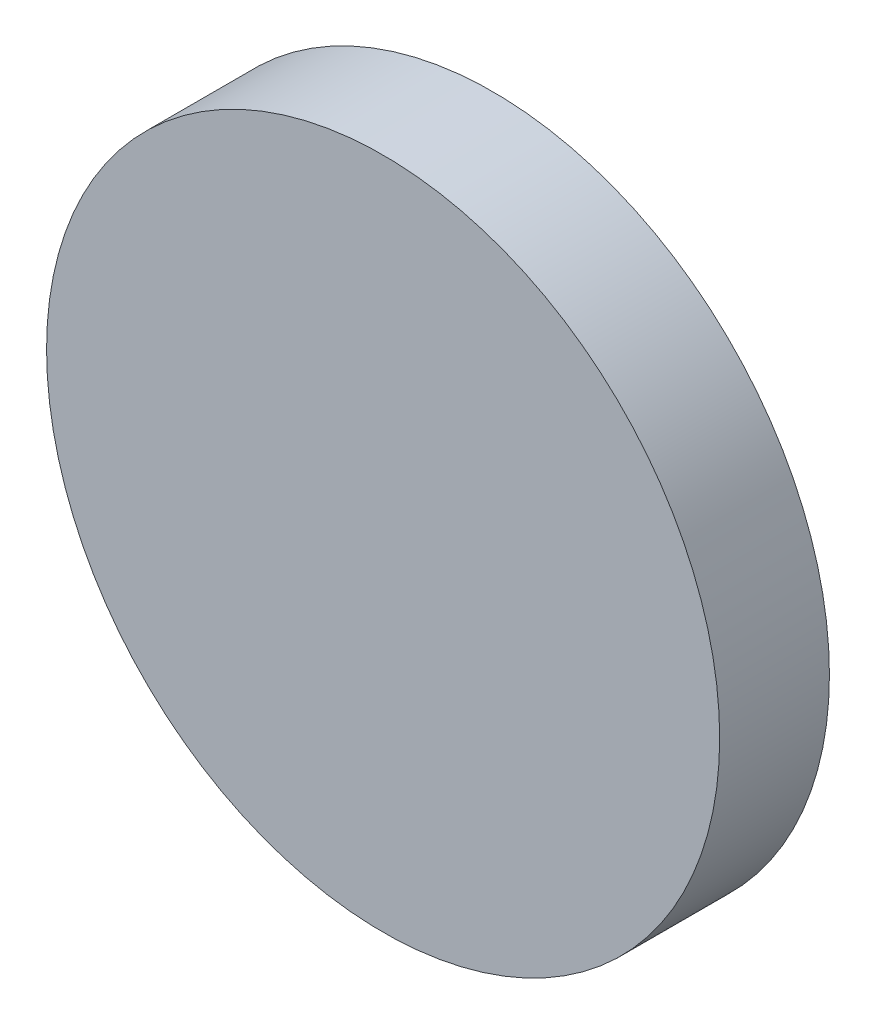
ISO-10303-21;
HEADER;
FILE_DESCRIPTION(('STEP AP214'),'2;1');
FILE_NAME('part.step','',(''),(''),'','','');
FILE_SCHEMA(('AUTOMOTIVE_DESIGN { 1 0 10303 214 1 1 1 1 }'));
ENDSEC;
DATA;
#1=APPLICATION_CONTEXT('core data for automotive mechanical design processes');
#2=APPLICATION_PROTOCOL_DEFINITION('international standard','automotive_design',2000,#1);
#3=PRODUCT_CONTEXT('',#1,'mechanical');
#4=PRODUCT('Part','Part','',(#3));
#5=PRODUCT_RELATED_PRODUCT_CATEGORY('part','',(#4));
#6=PRODUCT_DEFINITION_FORMATION('','',#4);
#7=PRODUCT_DEFINITION_CONTEXT('part definition',#1,'design');
#8=PRODUCT_DEFINITION('design','',#6,#7);
#9=PRODUCT_DEFINITION_SHAPE('','',#8);
#10=(LENGTH_UNIT() NAMED_UNIT(*) SI_UNIT(.MILLI.,.METRE.));
#11=(NAMED_UNIT(*) PLANE_ANGLE_UNIT() SI_UNIT($,.RADIAN.));
#12=(NAMED_UNIT(*) SI_UNIT($,.STERADIAN.) SOLID_ANGLE_UNIT());
#13=UNCERTAINTY_MEASURE_WITH_UNIT(LENGTH_MEASURE(1.E-05),#10,'distance_accuracy_value','');
#14=(GEOMETRIC_REPRESENTATION_CONTEXT(3) GLOBAL_UNCERTAINTY_ASSIGNED_CONTEXT((#13)) GLOBAL_UNIT_ASSIGNED_CONTEXT((#10,
#11,#12)) REPRESENTATION_CONTEXT('',''));
#15=CARTESIAN_POINT('',(0.,0.,0.));
#16=DIRECTION('',(0.,0.,1.));
#17=DIRECTION('',(1.,0.,0.));
#18=AXIS2_PLACEMENT_3D('',#15,#16,#17);
#19=CARTESIAN_POINT('',(0.,0.,0.));
#20=DIRECTION('',(0.,0.,-1.));
#21=DIRECTION('',(-1.,0.,0.));
#22=AXIS2_PLACEMENT_3D('',#19,#20,#21);
#23=PLANE('',#22);
#24=CARTESIAN_POINT('',(0.,0.,0.));
#25=DIRECTION('',(0.,0.,1.));
#26=DIRECTION('',(1.,0.,0.));
#27=AXIS2_PLACEMENT_3D('',#24,#25,#26);
#28=CIRCLE('',#27,2.3);
#29=CARTESIAN_POINT('',(2.3,0.,0.));
#30=VERTEX_POINT('',#29);
#31=EDGE_CURVE('E18',#30,#30,#28,.T.);
#32=ORIENTED_EDGE('',*,*,#31,.F.);
#33=EDGE_LOOP('',(#32));
#34=FACE_BOUND('',#33,.T.);
#35=ADVANCED_FACE('F15',(#34),#23,.T.);
#36=CARTESIAN_POINT('',(0.,0.,0.));
#37=DIRECTION('',(0.,0.,1.));
#38=DIRECTION('',(1.,0.,0.));
#39=AXIS2_PLACEMENT_3D('',#36,#37,#38);
#40=CYLINDRICAL_SURFACE('',#39,2.3);
#41=ORIENTED_EDGE('',*,*,#31,.T.);
#42=EDGE_LOOP('',(#41));
#43=FACE_BOUND('',#42,.T.);
#44=CARTESIAN_POINT('',(0.,0.,0.75));
#45=DIRECTION('',(0.,0.,1.));
#46=DIRECTION('',(1.,0.,0.));
#47=AXIS2_PLACEMENT_3D('',#44,#45,#46);
#48=CIRCLE('',#47,2.3);
#49=CARTESIAN_POINT('',(2.3,0.,0.75));
#50=VERTEX_POINT('',#49);
#51=EDGE_CURVE('E10',#50,#50,#48,.F.);
#52=ORIENTED_EDGE('',*,*,#51,.T.);
#53=EDGE_LOOP('',(#52));
#54=FACE_BOUND('',#53,.T.);
#55=ADVANCED_FACE('F27',(#43,#54),#40,.T.);
#56=CARTESIAN_POINT('',(0.,0.,0.75));
#57=DIRECTION('',(0.,0.,-1.));
#58=DIRECTION('',(-1.,0.,0.));
#59=AXIS2_PLACEMENT_3D('',#56,#57,#58);
#60=PLANE('',#59);
#61=ORIENTED_EDGE('',*,*,#51,.F.);
#62=EDGE_LOOP('',(#61));
#63=FACE_BOUND('',#62,.T.);
#64=ADVANCED_FACE('F34',(#63),#60,.F.);
#65=CLOSED_SHELL('',(#35,#55,#64));
#66=MANIFOLD_SOLID_BREP('B1',#65);
#67=ADVANCED_BREP_SHAPE_REPRESENTATION('',(#18,#66),#14);
#68=SHAPE_DEFINITION_REPRESENTATION(#9,#67);
ENDSEC;
END-ISO-10303-21;
